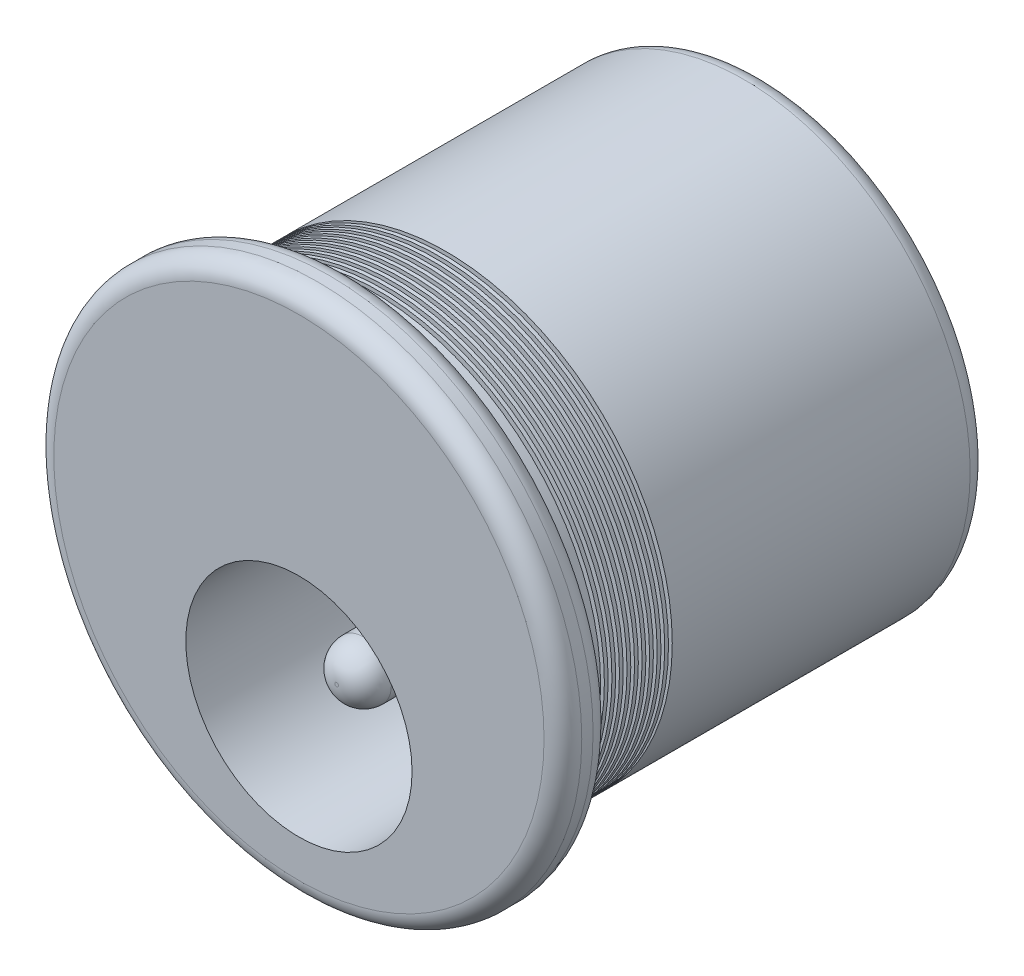
ISO-10303-21;
HEADER;
FILE_DESCRIPTION(('STEP AP214'),'2;1');
FILE_NAME('part.step','',(''),(''),'','','');
FILE_SCHEMA(('AUTOMOTIVE_DESIGN { 1 0 10303 214 1 1 1 1 }'));
ENDSEC;
DATA;
#1=APPLICATION_CONTEXT('core data for automotive mechanical design processes');
#2=APPLICATION_PROTOCOL_DEFINITION('international standard','automotive_design',2000,#1);
#3=PRODUCT_CONTEXT('',#1,'mechanical');
#4=PRODUCT('Part','Part','',(#3));
#5=PRODUCT_RELATED_PRODUCT_CATEGORY('part','',(#4));
#6=PRODUCT_DEFINITION_FORMATION('','',#4);
#7=PRODUCT_DEFINITION_CONTEXT('part definition',#1,'design');
#8=PRODUCT_DEFINITION('design','',#6,#7);
#9=PRODUCT_DEFINITION_SHAPE('','',#8);
#10=(LENGTH_UNIT() NAMED_UNIT(*) SI_UNIT(.MILLI.,.METRE.));
#11=(NAMED_UNIT(*) PLANE_ANGLE_UNIT() SI_UNIT($,.RADIAN.));
#12=(NAMED_UNIT(*) SI_UNIT($,.STERADIAN.) SOLID_ANGLE_UNIT());
#13=UNCERTAINTY_MEASURE_WITH_UNIT(LENGTH_MEASURE(1.E-05),#10,'distance_accuracy_value','');
#14=(GEOMETRIC_REPRESENTATION_CONTEXT(3) GLOBAL_UNCERTAINTY_ASSIGNED_CONTEXT((#13)) GLOBAL_UNIT_ASSIGNED_CONTEXT((#10,
#11,#12)) REPRESENTATION_CONTEXT('',''));
#15=CARTESIAN_POINT('',(0.,0.,0.));
#16=DIRECTION('',(0.,0.,1.));
#17=DIRECTION('',(1.,0.,0.));
#18=AXIS2_PLACEMENT_3D('',#15,#16,#17);
#19=CARTESIAN_POINT('',(0.,0.,1.3));
#20=DIRECTION('',(0.,0.,-1.));
#21=DIRECTION('',(-1.,0.,0.));
#22=AXIS2_PLACEMENT_3D('',#19,#20,#21);
#23=CYLINDRICAL_SURFACE('',#22,7.);
#24=CARTESIAN_POINT('',(0.,0.,0.5));
#25=DIRECTION('',(0.,0.,-1.));
#26=DIRECTION('',(-1.,0.,0.));
#27=AXIS2_PLACEMENT_3D('',#24,#25,#26);
#28=CIRCLE('',#27,7.);
#29=CARTESIAN_POINT('',(-7.,0.,0.5));
#30=VERTEX_POINT('',#29);
#31=EDGE_CURVE('E52',#30,#30,#28,.F.);
#32=ORIENTED_EDGE('',*,*,#31,.T.);
#33=EDGE_LOOP('',(#32));
#34=FACE_BOUND('',#33,.T.);
#35=CARTESIAN_POINT('',(0.,0.,0.8));
#36=DIRECTION('',(0.,0.,1.));
#37=DIRECTION('',(1.,0.,0.));
#38=AXIS2_PLACEMENT_3D('',#35,#36,#37);
#39=CIRCLE('',#38,7.);
#40=CARTESIAN_POINT('',(7.,0.,0.8));
#41=VERTEX_POINT('',#40);
#42=EDGE_CURVE('E57',#41,#41,#39,.F.);
#43=ORIENTED_EDGE('',*,*,#42,.T.);
#44=EDGE_LOOP('',(#43));
#45=FACE_BOUND('',#44,.T.);
#46=ADVANCED_FACE('F37',(#34,#45),#23,.T.);
#47=CARTESIAN_POINT('',(7.,0.,1.3));
#48=DIRECTION('',(0.,0.,1.));
#49=DIRECTION('',(1.,0.,0.));
#50=AXIS2_PLACEMENT_3D('',#47,#48,#49);
#51=PLANE('',#50);
#52=CARTESIAN_POINT('',(0.,0.,1.3));
#53=DIRECTION('',(0.,0.,1.));
#54=DIRECTION('',(1.,0.,0.));
#55=AXIS2_PLACEMENT_3D('',#52,#53,#54);
#56=CIRCLE('',#55,6.5);
#57=CARTESIAN_POINT('',(6.5,0.,1.3));
#58=VERTEX_POINT('',#57);
#59=EDGE_CURVE('E48',#58,#58,#56,.T.);
#60=ORIENTED_EDGE('',*,*,#59,.T.);
#61=EDGE_LOOP('',(#60));
#62=FACE_BOUND('',#61,.T.);
#63=CARTESIAN_POINT('',(0.,-2.5,1.3));
#64=DIRECTION('',(0.,0.,1.));
#65=DIRECTION('',(1.,0.,0.));
#66=AXIS2_PLACEMENT_3D('',#63,#64,#65);
#67=CIRCLE('',#66,2.99999999999999);
#68=CARTESIAN_POINT('',(2.99999999999999,-2.5,1.3));
#69=VERTEX_POINT('',#68);
#70=EDGE_CURVE('E195',#69,#69,#67,.T.);
#71=ORIENTED_EDGE('',*,*,#70,.F.);
#72=EDGE_LOOP('',(#71));
#73=FACE_BOUND('',#72,.T.);
#74=ADVANCED_FACE('F217',(#62,#73),#51,.T.);
#75=CARTESIAN_POINT('',(0.,0.,-11.));
#76=DIRECTION('',(0.,0.,-1.));
#77=DIRECTION('',(-1.,0.,0.));
#78=AXIS2_PLACEMENT_3D('',#75,#76,#77);
#79=PLANE('',#78);
#80=CARTESIAN_POINT('',(0.,0.,-11.));
#81=DIRECTION('',(0.,0.,-1.));
#82=DIRECTION('',(-1.,0.,0.));
#83=AXIS2_PLACEMENT_3D('',#80,#81,#82);
#84=CIRCLE('',#83,5.5);
#85=CARTESIAN_POINT('',(-5.5,0.,-11.));
#86=VERTEX_POINT('',#85);
#87=EDGE_CURVE('E66',#86,#86,#84,.T.);
#88=ORIENTED_EDGE('',*,*,#87,.T.);
#89=EDGE_LOOP('',(#88));
#90=FACE_BOUND('',#89,.T.);
#91=ADVANCED_FACE('F219',(#90),#79,.T.);
#92=CARTESIAN_POINT('',(0.,0.,1.3));
#93=DIRECTION('',(0.,0.,-1.));
#94=DIRECTION('',(-1.,0.,0.));
#95=AXIS2_PLACEMENT_3D('',#92,#93,#94);
#96=CYLINDRICAL_SURFACE('',#95,6.);
#97=CARTESIAN_POINT('',(0.,0.,-10.5));
#98=DIRECTION('',(0.,0.,-1.));
#99=DIRECTION('',(-1.,0.,0.));
#100=AXIS2_PLACEMENT_3D('',#97,#98,#99);
#101=CIRCLE('',#100,6.);
#102=CARTESIAN_POINT('',(-6.,0.,-10.5));
#103=VERTEX_POINT('',#102);
#104=EDGE_CURVE('E63',#103,#103,#101,.F.);
#105=ORIENTED_EDGE('',*,*,#104,.T.);
#106=EDGE_LOOP('',(#105));
#107=FACE_BOUND('',#106,.T.);
#108=CARTESIAN_POINT('',(0.,0.,-2.6));
#109=DIRECTION('',(0.,0.,-1.));
#110=DIRECTION('',(-1.,0.,0.));
#111=AXIS2_PLACEMENT_3D('',#108,#109,#110);
#112=CIRCLE('',#111,6.);
#113=CARTESIAN_POINT('',(-6.,0.,-2.6));
#114=VERTEX_POINT('',#113);
#115=EDGE_CURVE('E69',#114,#114,#112,.T.);
#116=ORIENTED_EDGE('',*,*,#115,.T.);
#117=EDGE_LOOP('',(#116));
#118=FACE_BOUND('',#117,.T.);
#119=ADVANCED_FACE('F226',(#107,#118),#96,.T.);
#120=CARTESIAN_POINT('',(6.,0.,-2.6));
#121=DIRECTION('',(0.,0.,1.));
#122=DIRECTION('',(1.,0.,0.));
#123=AXIS2_PLACEMENT_3D('',#120,#121,#122);
#124=PLANE('',#123);
#125=CARTESIAN_POINT('',(0.,0.,-2.6));
#126=DIRECTION('',(0.,0.,-1.));
#127=DIRECTION('',(-1.,0.,0.));
#128=AXIS2_PLACEMENT_3D('',#125,#126,#127);
#129=CIRCLE('',#128,5.75);
#130=CARTESIAN_POINT('',(-5.75,0.,-2.6));
#131=VERTEX_POINT('',#130);
#132=EDGE_CURVE('E72',#131,#131,#129,.T.);
#133=ORIENTED_EDGE('',*,*,#132,.T.);
#134=EDGE_LOOP('',(#133));
#135=FACE_BOUND('',#134,.T.);
#136=ORIENTED_EDGE('',*,*,#115,.F.);
#137=EDGE_LOOP('',(#136));
#138=FACE_BOUND('',#137,.T.);
#139=ADVANCED_FACE('F322',(#135,#138),#124,.T.);
#140=CARTESIAN_POINT('',(0.,0.,1.3));
#141=DIRECTION('',(0.,0.,-1.));
#142=DIRECTION('',(-1.,0.,0.));
#143=AXIS2_PLACEMENT_3D('',#140,#141,#142);
#144=CYLINDRICAL_SURFACE('',#143,5.75);
#145=CARTESIAN_POINT('',(0.,0.,-2.5));
#146=DIRECTION('',(0.,0.,-1.));
#147=DIRECTION('',(-1.,0.,0.));
#148=AXIS2_PLACEMENT_3D('',#145,#146,#147);
#149=CIRCLE('',#148,5.75);
#150=CARTESIAN_POINT('',(-5.75,0.,-2.5));
#151=VERTEX_POINT('',#150);
#152=EDGE_CURVE('E75',#151,#151,#149,.T.);
#153=ORIENTED_EDGE('',*,*,#152,.T.);
#154=EDGE_LOOP('',(#153));
#155=FACE_BOUND('',#154,.T.);
#156=ORIENTED_EDGE('',*,*,#132,.F.);
#157=EDGE_LOOP('',(#156));
#158=FACE_BOUND('',#157,.T.);
#159=ADVANCED_FACE('F772',(#155,#158),#144,.T.);
#160=CARTESIAN_POINT('',(5.75,0.,-2.5));
#161=DIRECTION('',(0.,0.,-1.));
#162=DIRECTION('',(-1.,0.,0.));
#163=AXIS2_PLACEMENT_3D('',#160,#161,#162);
#164=PLANE('',#163);
#165=CARTESIAN_POINT('',(0.,0.,-2.5));
#166=DIRECTION('',(0.,0.,-1.));
#167=DIRECTION('',(-1.,0.,0.));
#168=AXIS2_PLACEMENT_3D('',#165,#166,#167);
#169=CIRCLE('',#168,6.);
#170=CARTESIAN_POINT('',(-6.,0.,-2.5));
#171=VERTEX_POINT('',#170);
#172=EDGE_CURVE('E78',#171,#171,#169,.T.);
#173=ORIENTED_EDGE('',*,*,#172,.T.);
#174=EDGE_LOOP('',(#173));
#175=FACE_BOUND('',#174,.T.);
#176=ORIENTED_EDGE('',*,*,#152,.F.);
#177=EDGE_LOOP('',(#176));
#178=FACE_BOUND('',#177,.T.);
#179=ADVANCED_FACE('F761',(#175,#178),#164,.T.);
#180=CARTESIAN_POINT('',(0.,0.,1.3));
#181=DIRECTION('',(0.,0.,-1.));
#182=DIRECTION('',(-1.,0.,0.));
#183=AXIS2_PLACEMENT_3D('',#180,#181,#182);
#184=CYLINDRICAL_SURFACE('',#183,6.);
#185=CARTESIAN_POINT('',(0.,0.,-2.4));
#186=DIRECTION('',(0.,0.,-1.));
#187=DIRECTION('',(-1.,0.,0.));
#188=AXIS2_PLACEMENT_3D('',#185,#186,#187);
#189=CIRCLE('',#188,6.);
#190=CARTESIAN_POINT('',(-6.,0.,-2.4));
#191=VERTEX_POINT('',#190);
#192=EDGE_CURVE('E81',#191,#191,#189,.T.);
#193=ORIENTED_EDGE('',*,*,#192,.T.);
#194=EDGE_LOOP('',(#193));
#195=FACE_BOUND('',#194,.T.);
#196=ORIENTED_EDGE('',*,*,#172,.F.);
#197=EDGE_LOOP('',(#196));
#198=FACE_BOUND('',#197,.T.);
#199=ADVANCED_FACE('F750',(#195,#198),#184,.T.);
#200=CARTESIAN_POINT('',(6.,0.,-2.4));
#201=DIRECTION('',(0.,0.,1.));
#202=DIRECTION('',(1.,0.,0.));
#203=AXIS2_PLACEMENT_3D('',#200,#201,#202);
#204=PLANE('',#203);
#205=CARTESIAN_POINT('',(0.,0.,-2.4));
#206=DIRECTION('',(0.,0.,-1.));
#207=DIRECTION('',(-1.,0.,0.));
#208=AXIS2_PLACEMENT_3D('',#205,#206,#207);
#209=CIRCLE('',#208,5.75);
#210=CARTESIAN_POINT('',(-5.75,0.,-2.4));
#211=VERTEX_POINT('',#210);
#212=EDGE_CURVE('E84',#211,#211,#209,.T.);
#213=ORIENTED_EDGE('',*,*,#212,.T.);
#214=EDGE_LOOP('',(#213));
#215=FACE_BOUND('',#214,.T.);
#216=ORIENTED_EDGE('',*,*,#192,.F.);
#217=EDGE_LOOP('',(#216));
#218=FACE_BOUND('',#217,.T.);
#219=ADVANCED_FACE('F739',(#215,#218),#204,.T.);
#220=CARTESIAN_POINT('',(0.,0.,1.3));
#221=DIRECTION('',(0.,0.,-1.));
#222=DIRECTION('',(-1.,0.,0.));
#223=AXIS2_PLACEMENT_3D('',#220,#221,#222);
#224=CYLINDRICAL_SURFACE('',#223,5.75);
#225=CARTESIAN_POINT('',(0.,0.,-2.3));
#226=DIRECTION('',(0.,0.,-1.));
#227=DIRECTION('',(-1.,0.,0.));
#228=AXIS2_PLACEMENT_3D('',#225,#226,#227);
#229=CIRCLE('',#228,5.75);
#230=CARTESIAN_POINT('',(-5.75,0.,-2.3));
#231=VERTEX_POINT('',#230);
#232=EDGE_CURVE('E87',#231,#231,#229,.T.);
#233=ORIENTED_EDGE('',*,*,#232,.T.);
#234=EDGE_LOOP('',(#233));
#235=FACE_BOUND('',#234,.T.);
#236=ORIENTED_EDGE('',*,*,#212,.F.);
#237=EDGE_LOOP('',(#236));
#238=FACE_BOUND('',#237,.T.);
#239=ADVANCED_FACE('F728',(#235,#238),#224,.T.);
#240=CARTESIAN_POINT('',(5.75,0.,-2.3));
#241=DIRECTION('',(0.,0.,-1.));
#242=DIRECTION('',(-1.,0.,0.));
#243=AXIS2_PLACEMENT_3D('',#240,#241,#242);
#244=PLANE('',#243);
#245=CARTESIAN_POINT('',(0.,0.,-2.3));
#246=DIRECTION('',(0.,0.,-1.));
#247=DIRECTION('',(-1.,0.,0.));
#248=AXIS2_PLACEMENT_3D('',#245,#246,#247);
#249=CIRCLE('',#248,6.);
#250=CARTESIAN_POINT('',(-6.,0.,-2.3));
#251=VERTEX_POINT('',#250);
#252=EDGE_CURVE('E90',#251,#251,#249,.T.);
#253=ORIENTED_EDGE('',*,*,#252,.T.);
#254=EDGE_LOOP('',(#253));
#255=FACE_BOUND('',#254,.T.);
#256=ORIENTED_EDGE('',*,*,#232,.F.);
#257=EDGE_LOOP('',(#256));
#258=FACE_BOUND('',#257,.T.);
#259=ADVANCED_FACE('F717',(#255,#258),#244,.T.);
#260=CARTESIAN_POINT('',(0.,0.,1.3));
#261=DIRECTION('',(0.,0.,-1.));
#262=DIRECTION('',(-1.,0.,0.));
#263=AXIS2_PLACEMENT_3D('',#260,#261,#262);
#264=CYLINDRICAL_SURFACE('',#263,6.);
#265=CARTESIAN_POINT('',(0.,0.,-2.2));
#266=DIRECTION('',(0.,0.,-1.));
#267=DIRECTION('',(-1.,0.,0.));
#268=AXIS2_PLACEMENT_3D('',#265,#266,#267);
#269=CIRCLE('',#268,6.);
#270=CARTESIAN_POINT('',(-6.,0.,-2.2));
#271=VERTEX_POINT('',#270);
#272=EDGE_CURVE('E93',#271,#271,#269,.T.);
#273=ORIENTED_EDGE('',*,*,#272,.T.);
#274=EDGE_LOOP('',(#273));
#275=FACE_BOUND('',#274,.T.);
#276=ORIENTED_EDGE('',*,*,#252,.F.);
#277=EDGE_LOOP('',(#276));
#278=FACE_BOUND('',#277,.T.);
#279=ADVANCED_FACE('F706',(#275,#278),#264,.T.);
#280=CARTESIAN_POINT('',(6.,0.,-2.2));
#281=DIRECTION('',(0.,0.,1.));
#282=DIRECTION('',(1.,0.,0.));
#283=AXIS2_PLACEMENT_3D('',#280,#281,#282);
#284=PLANE('',#283);
#285=CARTESIAN_POINT('',(0.,0.,-2.2));
#286=DIRECTION('',(0.,0.,-1.));
#287=DIRECTION('',(-1.,0.,0.));
#288=AXIS2_PLACEMENT_3D('',#285,#286,#287);
#289=CIRCLE('',#288,5.75);
#290=CARTESIAN_POINT('',(-5.75,0.,-2.2));
#291=VERTEX_POINT('',#290);
#292=EDGE_CURVE('E96',#291,#291,#289,.T.);
#293=ORIENTED_EDGE('',*,*,#292,.T.);
#294=EDGE_LOOP('',(#293));
#295=FACE_BOUND('',#294,.T.);
#296=ORIENTED_EDGE('',*,*,#272,.F.);
#297=EDGE_LOOP('',(#296));
#298=FACE_BOUND('',#297,.T.);
#299=ADVANCED_FACE('F695',(#295,#298),#284,.T.);
#300=CARTESIAN_POINT('',(0.,0.,1.3));
#301=DIRECTION('',(0.,0.,-1.));
#302=DIRECTION('',(-1.,0.,0.));
#303=AXIS2_PLACEMENT_3D('',#300,#301,#302);
#304=CYLINDRICAL_SURFACE('',#303,5.75);
#305=CARTESIAN_POINT('',(0.,0.,-2.1));
#306=DIRECTION('',(0.,0.,-1.));
#307=DIRECTION('',(-1.,0.,0.));
#308=AXIS2_PLACEMENT_3D('',#305,#306,#307);
#309=CIRCLE('',#308,5.75);
#310=CARTESIAN_POINT('',(-5.75,0.,-2.1));
#311=VERTEX_POINT('',#310);
#312=EDGE_CURVE('E99',#311,#311,#309,.T.);
#313=ORIENTED_EDGE('',*,*,#312,.T.);
#314=EDGE_LOOP('',(#313));
#315=FACE_BOUND('',#314,.T.);
#316=ORIENTED_EDGE('',*,*,#292,.F.);
#317=EDGE_LOOP('',(#316));
#318=FACE_BOUND('',#317,.T.);
#319=ADVANCED_FACE('F684',(#315,#318),#304,.T.);
#320=CARTESIAN_POINT('',(5.75,0.,-2.1));
#321=DIRECTION('',(0.,0.,-1.));
#322=DIRECTION('',(-1.,0.,0.));
#323=AXIS2_PLACEMENT_3D('',#320,#321,#322);
#324=PLANE('',#323);
#325=CARTESIAN_POINT('',(0.,0.,-2.1));
#326=DIRECTION('',(0.,0.,-1.));
#327=DIRECTION('',(-1.,0.,0.));
#328=AXIS2_PLACEMENT_3D('',#325,#326,#327);
#329=CIRCLE('',#328,6.);
#330=CARTESIAN_POINT('',(-6.,0.,-2.1));
#331=VERTEX_POINT('',#330);
#332=EDGE_CURVE('E102',#331,#331,#329,.T.);
#333=ORIENTED_EDGE('',*,*,#332,.T.);
#334=EDGE_LOOP('',(#333));
#335=FACE_BOUND('',#334,.T.);
#336=ORIENTED_EDGE('',*,*,#312,.F.);
#337=EDGE_LOOP('',(#336));
#338=FACE_BOUND('',#337,.T.);
#339=ADVANCED_FACE('F673',(#335,#338),#324,.T.);
#340=CARTESIAN_POINT('',(0.,0.,1.3));
#341=DIRECTION('',(0.,0.,-1.));
#342=DIRECTION('',(-1.,0.,0.));
#343=AXIS2_PLACEMENT_3D('',#340,#341,#342);
#344=CYLINDRICAL_SURFACE('',#343,6.);
#345=CARTESIAN_POINT('',(0.,0.,-2.));
#346=DIRECTION('',(0.,0.,-1.));
#347=DIRECTION('',(-1.,0.,0.));
#348=AXIS2_PLACEMENT_3D('',#345,#346,#347);
#349=CIRCLE('',#348,6.);
#350=CARTESIAN_POINT('',(-6.,0.,-2.));
#351=VERTEX_POINT('',#350);
#352=EDGE_CURVE('E105',#351,#351,#349,.T.);
#353=ORIENTED_EDGE('',*,*,#352,.T.);
#354=EDGE_LOOP('',(#353));
#355=FACE_BOUND('',#354,.T.);
#356=ORIENTED_EDGE('',*,*,#332,.F.);
#357=EDGE_LOOP('',(#356));
#358=FACE_BOUND('',#357,.T.);
#359=ADVANCED_FACE('F662',(#355,#358),#344,.T.);
#360=CARTESIAN_POINT('',(6.,0.,-2.));
#361=DIRECTION('',(0.,0.,1.));
#362=DIRECTION('',(1.,0.,0.));
#363=AXIS2_PLACEMENT_3D('',#360,#361,#362);
#364=PLANE('',#363);
#365=CARTESIAN_POINT('',(0.,0.,-2.));
#366=DIRECTION('',(0.,0.,-1.));
#367=DIRECTION('',(-1.,0.,0.));
#368=AXIS2_PLACEMENT_3D('',#365,#366,#367);
#369=CIRCLE('',#368,5.75);
#370=CARTESIAN_POINT('',(-5.75,0.,-2.));
#371=VERTEX_POINT('',#370);
#372=EDGE_CURVE('E108',#371,#371,#369,.T.);
#373=ORIENTED_EDGE('',*,*,#372,.T.);
#374=EDGE_LOOP('',(#373));
#375=FACE_BOUND('',#374,.T.);
#376=ORIENTED_EDGE('',*,*,#352,.F.);
#377=EDGE_LOOP('',(#376));
#378=FACE_BOUND('',#377,.T.);
#379=ADVANCED_FACE('F651',(#375,#378),#364,.T.);
#380=CARTESIAN_POINT('',(0.,0.,1.3));
#381=DIRECTION('',(0.,0.,-1.));
#382=DIRECTION('',(-1.,0.,0.));
#383=AXIS2_PLACEMENT_3D('',#380,#381,#382);
#384=CYLINDRICAL_SURFACE('',#383,5.75);
#385=CARTESIAN_POINT('',(0.,0.,-1.9));
#386=DIRECTION('',(0.,0.,-1.));
#387=DIRECTION('',(-1.,0.,0.));
#388=AXIS2_PLACEMENT_3D('',#385,#386,#387);
#389=CIRCLE('',#388,5.75);
#390=CARTESIAN_POINT('',(-5.75,0.,-1.9));
#391=VERTEX_POINT('',#390);
#392=EDGE_CURVE('E111',#391,#391,#389,.T.);
#393=ORIENTED_EDGE('',*,*,#392,.T.);
#394=EDGE_LOOP('',(#393));
#395=FACE_BOUND('',#394,.T.);
#396=ORIENTED_EDGE('',*,*,#372,.F.);
#397=EDGE_LOOP('',(#396));
#398=FACE_BOUND('',#397,.T.);
#399=ADVANCED_FACE('F640',(#395,#398),#384,.T.);
#400=CARTESIAN_POINT('',(5.75,0.,-1.9));
#401=DIRECTION('',(0.,0.,-1.));
#402=DIRECTION('',(-1.,0.,0.));
#403=AXIS2_PLACEMENT_3D('',#400,#401,#402);
#404=PLANE('',#403);
#405=CARTESIAN_POINT('',(0.,0.,-1.9));
#406=DIRECTION('',(0.,0.,-1.));
#407=DIRECTION('',(-1.,0.,0.));
#408=AXIS2_PLACEMENT_3D('',#405,#406,#407);
#409=CIRCLE('',#408,6.);
#410=CARTESIAN_POINT('',(-6.,0.,-1.9));
#411=VERTEX_POINT('',#410);
#412=EDGE_CURVE('E114',#411,#411,#409,.T.);
#413=ORIENTED_EDGE('',*,*,#412,.T.);
#414=EDGE_LOOP('',(#413));
#415=FACE_BOUND('',#414,.T.);
#416=ORIENTED_EDGE('',*,*,#392,.F.);
#417=EDGE_LOOP('',(#416));
#418=FACE_BOUND('',#417,.T.);
#419=ADVANCED_FACE('F629',(#415,#418),#404,.T.);
#420=CARTESIAN_POINT('',(0.,0.,1.3));
#421=DIRECTION('',(0.,0.,-1.));
#422=DIRECTION('',(-1.,0.,0.));
#423=AXIS2_PLACEMENT_3D('',#420,#421,#422);
#424=CYLINDRICAL_SURFACE('',#423,6.);
#425=CARTESIAN_POINT('',(0.,0.,-1.8));
#426=DIRECTION('',(0.,0.,-1.));
#427=DIRECTION('',(-1.,0.,0.));
#428=AXIS2_PLACEMENT_3D('',#425,#426,#427);
#429=CIRCLE('',#428,6.);
#430=CARTESIAN_POINT('',(-6.,0.,-1.8));
#431=VERTEX_POINT('',#430);
#432=EDGE_CURVE('E117',#431,#431,#429,.T.);
#433=ORIENTED_EDGE('',*,*,#432,.T.);
#434=EDGE_LOOP('',(#433));
#435=FACE_BOUND('',#434,.T.);
#436=ORIENTED_EDGE('',*,*,#412,.F.);
#437=EDGE_LOOP('',(#436));
#438=FACE_BOUND('',#437,.T.);
#439=ADVANCED_FACE('F618',(#435,#438),#424,.T.);
#440=CARTESIAN_POINT('',(6.,0.,-1.8));
#441=DIRECTION('',(0.,0.,1.));
#442=DIRECTION('',(1.,0.,0.));
#443=AXIS2_PLACEMENT_3D('',#440,#441,#442);
#444=PLANE('',#443);
#445=CARTESIAN_POINT('',(0.,0.,-1.8));
#446=DIRECTION('',(0.,0.,-1.));
#447=DIRECTION('',(-1.,0.,0.));
#448=AXIS2_PLACEMENT_3D('',#445,#446,#447);
#449=CIRCLE('',#448,5.75);
#450=CARTESIAN_POINT('',(-5.75,0.,-1.8));
#451=VERTEX_POINT('',#450);
#452=EDGE_CURVE('E120',#451,#451,#449,.T.);
#453=ORIENTED_EDGE('',*,*,#452,.T.);
#454=EDGE_LOOP('',(#453));
#455=FACE_BOUND('',#454,.T.);
#456=ORIENTED_EDGE('',*,*,#432,.F.);
#457=EDGE_LOOP('',(#456));
#458=FACE_BOUND('',#457,.T.);
#459=ADVANCED_FACE('F607',(#455,#458),#444,.T.);
#460=CARTESIAN_POINT('',(0.,0.,1.3));
#461=DIRECTION('',(0.,0.,-1.));
#462=DIRECTION('',(-1.,0.,0.));
#463=AXIS2_PLACEMENT_3D('',#460,#461,#462);
#464=CYLINDRICAL_SURFACE('',#463,5.75);
#465=CARTESIAN_POINT('',(0.,0.,-1.7));
#466=DIRECTION('',(0.,0.,-1.));
#467=DIRECTION('',(-1.,0.,0.));
#468=AXIS2_PLACEMENT_3D('',#465,#466,#467);
#469=CIRCLE('',#468,5.75);
#470=CARTESIAN_POINT('',(-5.75,0.,-1.7));
#471=VERTEX_POINT('',#470);
#472=EDGE_CURVE('E123',#471,#471,#469,.T.);
#473=ORIENTED_EDGE('',*,*,#472,.T.);
#474=EDGE_LOOP('',(#473));
#475=FACE_BOUND('',#474,.T.);
#476=ORIENTED_EDGE('',*,*,#452,.F.);
#477=EDGE_LOOP('',(#476));
#478=FACE_BOUND('',#477,.T.);
#479=ADVANCED_FACE('F596',(#475,#478),#464,.T.);
#480=CARTESIAN_POINT('',(5.75,0.,-1.7));
#481=DIRECTION('',(0.,0.,-1.));
#482=DIRECTION('',(-1.,0.,0.));
#483=AXIS2_PLACEMENT_3D('',#480,#481,#482);
#484=PLANE('',#483);
#485=CARTESIAN_POINT('',(0.,0.,-1.7));
#486=DIRECTION('',(0.,0.,-1.));
#487=DIRECTION('',(-1.,0.,0.));
#488=AXIS2_PLACEMENT_3D('',#485,#486,#487);
#489=CIRCLE('',#488,6.);
#490=CARTESIAN_POINT('',(-6.,0.,-1.7));
#491=VERTEX_POINT('',#490);
#492=EDGE_CURVE('E126',#491,#491,#489,.T.);
#493=ORIENTED_EDGE('',*,*,#492,.T.);
#494=EDGE_LOOP('',(#493));
#495=FACE_BOUND('',#494,.T.);
#496=ORIENTED_EDGE('',*,*,#472,.F.);
#497=EDGE_LOOP('',(#496));
#498=FACE_BOUND('',#497,.T.);
#499=ADVANCED_FACE('F585',(#495,#498),#484,.T.);
#500=CARTESIAN_POINT('',(0.,0.,1.3));
#501=DIRECTION('',(0.,0.,-1.));
#502=DIRECTION('',(-1.,0.,0.));
#503=AXIS2_PLACEMENT_3D('',#500,#501,#502);
#504=CYLINDRICAL_SURFACE('',#503,6.);
#505=CARTESIAN_POINT('',(0.,0.,-1.6));
#506=DIRECTION('',(0.,0.,-1.));
#507=DIRECTION('',(-1.,0.,0.));
#508=AXIS2_PLACEMENT_3D('',#505,#506,#507);
#509=CIRCLE('',#508,6.);
#510=CARTESIAN_POINT('',(-6.,0.,-1.6));
#511=VERTEX_POINT('',#510);
#512=EDGE_CURVE('E129',#511,#511,#509,.T.);
#513=ORIENTED_EDGE('',*,*,#512,.T.);
#514=EDGE_LOOP('',(#513));
#515=FACE_BOUND('',#514,.T.);
#516=ORIENTED_EDGE('',*,*,#492,.F.);
#517=EDGE_LOOP('',(#516));
#518=FACE_BOUND('',#517,.T.);
#519=ADVANCED_FACE('F574',(#515,#518),#504,.T.);
#520=CARTESIAN_POINT('',(6.,0.,-1.6));
#521=DIRECTION('',(0.,0.,1.));
#522=DIRECTION('',(1.,0.,0.));
#523=AXIS2_PLACEMENT_3D('',#520,#521,#522);
#524=PLANE('',#523);
#525=CARTESIAN_POINT('',(0.,0.,-1.6));
#526=DIRECTION('',(0.,0.,-1.));
#527=DIRECTION('',(-1.,0.,0.));
#528=AXIS2_PLACEMENT_3D('',#525,#526,#527);
#529=CIRCLE('',#528,5.75);
#530=CARTESIAN_POINT('',(-5.75,0.,-1.6));
#531=VERTEX_POINT('',#530);
#532=EDGE_CURVE('E132',#531,#531,#529,.T.);
#533=ORIENTED_EDGE('',*,*,#532,.T.);
#534=EDGE_LOOP('',(#533));
#535=FACE_BOUND('',#534,.T.);
#536=ORIENTED_EDGE('',*,*,#512,.F.);
#537=EDGE_LOOP('',(#536));
#538=FACE_BOUND('',#537,.T.);
#539=ADVANCED_FACE('F563',(#535,#538),#524,.T.);
#540=CARTESIAN_POINT('',(0.,0.,1.3));
#541=DIRECTION('',(0.,0.,-1.));
#542=DIRECTION('',(-1.,0.,0.));
#543=AXIS2_PLACEMENT_3D('',#540,#541,#542);
#544=CYLINDRICAL_SURFACE('',#543,5.75);
#545=CARTESIAN_POINT('',(0.,0.,-1.5));
#546=DIRECTION('',(0.,0.,-1.));
#547=DIRECTION('',(-1.,0.,0.));
#548=AXIS2_PLACEMENT_3D('',#545,#546,#547);
#549=CIRCLE('',#548,5.75);
#550=CARTESIAN_POINT('',(-5.75,0.,-1.5));
#551=VERTEX_POINT('',#550);
#552=EDGE_CURVE('E135',#551,#551,#549,.T.);
#553=ORIENTED_EDGE('',*,*,#552,.T.);
#554=EDGE_LOOP('',(#553));
#555=FACE_BOUND('',#554,.T.);
#556=ORIENTED_EDGE('',*,*,#532,.F.);
#557=EDGE_LOOP('',(#556));
#558=FACE_BOUND('',#557,.T.);
#559=ADVANCED_FACE('F552',(#555,#558),#544,.T.);
#560=CARTESIAN_POINT('',(5.75,0.,-1.5));
#561=DIRECTION('',(0.,0.,-1.));
#562=DIRECTION('',(-1.,0.,0.));
#563=AXIS2_PLACEMENT_3D('',#560,#561,#562);
#564=PLANE('',#563);
#565=CARTESIAN_POINT('',(0.,0.,-1.5));
#566=DIRECTION('',(0.,0.,-1.));
#567=DIRECTION('',(-1.,0.,0.));
#568=AXIS2_PLACEMENT_3D('',#565,#566,#567);
#569=CIRCLE('',#568,6.);
#570=CARTESIAN_POINT('',(-6.,0.,-1.5));
#571=VERTEX_POINT('',#570);
#572=EDGE_CURVE('E138',#571,#571,#569,.T.);
#573=ORIENTED_EDGE('',*,*,#572,.T.);
#574=EDGE_LOOP('',(#573));
#575=FACE_BOUND('',#574,.T.);
#576=ORIENTED_EDGE('',*,*,#552,.F.);
#577=EDGE_LOOP('',(#576));
#578=FACE_BOUND('',#577,.T.);
#579=ADVANCED_FACE('F541',(#575,#578),#564,.T.);
#580=CARTESIAN_POINT('',(0.,0.,1.3));
#581=DIRECTION('',(0.,0.,-1.));
#582=DIRECTION('',(-1.,0.,0.));
#583=AXIS2_PLACEMENT_3D('',#580,#581,#582);
#584=CYLINDRICAL_SURFACE('',#583,6.);
#585=CARTESIAN_POINT('',(0.,0.,-1.4));
#586=DIRECTION('',(0.,0.,-1.));
#587=DIRECTION('',(-1.,0.,0.));
#588=AXIS2_PLACEMENT_3D('',#585,#586,#587);
#589=CIRCLE('',#588,6.);
#590=CARTESIAN_POINT('',(-6.,0.,-1.4));
#591=VERTEX_POINT('',#590);
#592=EDGE_CURVE('E141',#591,#591,#589,.T.);
#593=ORIENTED_EDGE('',*,*,#592,.T.);
#594=EDGE_LOOP('',(#593));
#595=FACE_BOUND('',#594,.T.);
#596=ORIENTED_EDGE('',*,*,#572,.F.);
#597=EDGE_LOOP('',(#596));
#598=FACE_BOUND('',#597,.T.);
#599=ADVANCED_FACE('F530',(#595,#598),#584,.T.);
#600=CARTESIAN_POINT('',(6.,0.,-1.4));
#601=DIRECTION('',(0.,0.,1.));
#602=DIRECTION('',(1.,0.,0.));
#603=AXIS2_PLACEMENT_3D('',#600,#601,#602);
#604=PLANE('',#603);
#605=CARTESIAN_POINT('',(0.,0.,-1.4));
#606=DIRECTION('',(0.,0.,-1.));
#607=DIRECTION('',(-1.,0.,0.));
#608=AXIS2_PLACEMENT_3D('',#605,#606,#607);
#609=CIRCLE('',#608,5.75);
#610=CARTESIAN_POINT('',(-5.75,0.,-1.4));
#611=VERTEX_POINT('',#610);
#612=EDGE_CURVE('E144',#611,#611,#609,.T.);
#613=ORIENTED_EDGE('',*,*,#612,.T.);
#614=EDGE_LOOP('',(#613));
#615=FACE_BOUND('',#614,.T.);
#616=ORIENTED_EDGE('',*,*,#592,.F.);
#617=EDGE_LOOP('',(#616));
#618=FACE_BOUND('',#617,.T.);
#619=ADVANCED_FACE('F519',(#615,#618),#604,.T.);
#620=CARTESIAN_POINT('',(0.,0.,1.3));
#621=DIRECTION('',(0.,0.,-1.));
#622=DIRECTION('',(-1.,0.,0.));
#623=AXIS2_PLACEMENT_3D('',#620,#621,#622);
#624=CYLINDRICAL_SURFACE('',#623,5.75);
#625=CARTESIAN_POINT('',(0.,0.,-1.3));
#626=DIRECTION('',(0.,0.,-1.));
#627=DIRECTION('',(-1.,0.,0.));
#628=AXIS2_PLACEMENT_3D('',#625,#626,#627);
#629=CIRCLE('',#628,5.75);
#630=CARTESIAN_POINT('',(-5.75,0.,-1.3));
#631=VERTEX_POINT('',#630);
#632=EDGE_CURVE('E147',#631,#631,#629,.T.);
#633=ORIENTED_EDGE('',*,*,#632,.T.);
#634=EDGE_LOOP('',(#633));
#635=FACE_BOUND('',#634,.T.);
#636=ORIENTED_EDGE('',*,*,#612,.F.);
#637=EDGE_LOOP('',(#636));
#638=FACE_BOUND('',#637,.T.);
#639=ADVANCED_FACE('F508',(#635,#638),#624,.T.);
#640=CARTESIAN_POINT('',(5.75,0.,-1.3));
#641=DIRECTION('',(0.,0.,-1.));
#642=DIRECTION('',(-1.,0.,0.));
#643=AXIS2_PLACEMENT_3D('',#640,#641,#642);
#644=PLANE('',#643);
#645=CARTESIAN_POINT('',(0.,0.,-1.3));
#646=DIRECTION('',(0.,0.,-1.));
#647=DIRECTION('',(-1.,0.,0.));
#648=AXIS2_PLACEMENT_3D('',#645,#646,#647);
#649=CIRCLE('',#648,6.);
#650=CARTESIAN_POINT('',(-6.,0.,-1.3));
#651=VERTEX_POINT('',#650);
#652=EDGE_CURVE('E150',#651,#651,#649,.T.);
#653=ORIENTED_EDGE('',*,*,#652,.T.);
#654=EDGE_LOOP('',(#653));
#655=FACE_BOUND('',#654,.T.);
#656=ORIENTED_EDGE('',*,*,#632,.F.);
#657=EDGE_LOOP('',(#656));
#658=FACE_BOUND('',#657,.T.);
#659=ADVANCED_FACE('F497',(#655,#658),#644,.T.);
#660=CARTESIAN_POINT('',(0.,0.,1.3));
#661=DIRECTION('',(0.,0.,-1.));
#662=DIRECTION('',(-1.,0.,0.));
#663=AXIS2_PLACEMENT_3D('',#660,#661,#662);
#664=CYLINDRICAL_SURFACE('',#663,6.);
#665=CARTESIAN_POINT('',(0.,0.,-1.2));
#666=DIRECTION('',(0.,0.,-1.));
#667=DIRECTION('',(-1.,0.,0.));
#668=AXIS2_PLACEMENT_3D('',#665,#666,#667);
#669=CIRCLE('',#668,6.);
#670=CARTESIAN_POINT('',(-6.,0.,-1.2));
#671=VERTEX_POINT('',#670);
#672=EDGE_CURVE('E153',#671,#671,#669,.T.);
#673=ORIENTED_EDGE('',*,*,#672,.T.);
#674=EDGE_LOOP('',(#673));
#675=FACE_BOUND('',#674,.T.);
#676=ORIENTED_EDGE('',*,*,#652,.F.);
#677=EDGE_LOOP('',(#676));
#678=FACE_BOUND('',#677,.T.);
#679=ADVANCED_FACE('F486',(#675,#678),#664,.T.);
#680=CARTESIAN_POINT('',(6.,0.,-1.2));
#681=DIRECTION('',(0.,0.,1.));
#682=DIRECTION('',(1.,0.,0.));
#683=AXIS2_PLACEMENT_3D('',#680,#681,#682);
#684=PLANE('',#683);
#685=CARTESIAN_POINT('',(0.,0.,-1.2));
#686=DIRECTION('',(0.,0.,-1.));
#687=DIRECTION('',(-1.,0.,0.));
#688=AXIS2_PLACEMENT_3D('',#685,#686,#687);
#689=CIRCLE('',#688,5.75);
#690=CARTESIAN_POINT('',(-5.75,0.,-1.2));
#691=VERTEX_POINT('',#690);
#692=EDGE_CURVE('E156',#691,#691,#689,.T.);
#693=ORIENTED_EDGE('',*,*,#692,.T.);
#694=EDGE_LOOP('',(#693));
#695=FACE_BOUND('',#694,.T.);
#696=ORIENTED_EDGE('',*,*,#672,.F.);
#697=EDGE_LOOP('',(#696));
#698=FACE_BOUND('',#697,.T.);
#699=ADVANCED_FACE('F475',(#695,#698),#684,.T.);
#700=CARTESIAN_POINT('',(0.,0.,1.3));
#701=DIRECTION('',(0.,0.,-1.));
#702=DIRECTION('',(-1.,0.,0.));
#703=AXIS2_PLACEMENT_3D('',#700,#701,#702);
#704=CYLINDRICAL_SURFACE('',#703,5.75);
#705=CARTESIAN_POINT('',(0.,0.,-1.1));
#706=DIRECTION('',(0.,0.,-1.));
#707=DIRECTION('',(-1.,0.,0.));
#708=AXIS2_PLACEMENT_3D('',#705,#706,#707);
#709=CIRCLE('',#708,5.75);
#710=CARTESIAN_POINT('',(-5.75,0.,-1.1));
#711=VERTEX_POINT('',#710);
#712=EDGE_CURVE('E159',#711,#711,#709,.T.);
#713=ORIENTED_EDGE('',*,*,#712,.T.);
#714=EDGE_LOOP('',(#713));
#715=FACE_BOUND('',#714,.T.);
#716=ORIENTED_EDGE('',*,*,#692,.F.);
#717=EDGE_LOOP('',(#716));
#718=FACE_BOUND('',#717,.T.);
#719=ADVANCED_FACE('F464',(#715,#718),#704,.T.);
#720=CARTESIAN_POINT('',(5.75,0.,-1.1));
#721=DIRECTION('',(0.,0.,-1.));
#722=DIRECTION('',(-1.,0.,0.));
#723=AXIS2_PLACEMENT_3D('',#720,#721,#722);
#724=PLANE('',#723);
#725=CARTESIAN_POINT('',(0.,0.,-1.1));
#726=DIRECTION('',(0.,0.,-1.));
#727=DIRECTION('',(-1.,0.,0.));
#728=AXIS2_PLACEMENT_3D('',#725,#726,#727);
#729=CIRCLE('',#728,6.);
#730=CARTESIAN_POINT('',(-6.,0.,-1.1));
#731=VERTEX_POINT('',#730);
#732=EDGE_CURVE('E162',#731,#731,#729,.T.);
#733=ORIENTED_EDGE('',*,*,#732,.T.);
#734=EDGE_LOOP('',(#733));
#735=FACE_BOUND('',#734,.T.);
#736=ORIENTED_EDGE('',*,*,#712,.F.);
#737=EDGE_LOOP('',(#736));
#738=FACE_BOUND('',#737,.T.);
#739=ADVANCED_FACE('F453',(#735,#738),#724,.T.);
#740=CARTESIAN_POINT('',(0.,0.,1.3));
#741=DIRECTION('',(0.,0.,-1.));
#742=DIRECTION('',(-1.,0.,0.));
#743=AXIS2_PLACEMENT_3D('',#740,#741,#742);
#744=CYLINDRICAL_SURFACE('',#743,6.);
#745=CARTESIAN_POINT('',(0.,0.,-1.));
#746=DIRECTION('',(0.,0.,-1.));
#747=DIRECTION('',(-1.,0.,0.));
#748=AXIS2_PLACEMENT_3D('',#745,#746,#747);
#749=CIRCLE('',#748,6.);
#750=CARTESIAN_POINT('',(-6.,0.,-1.));
#751=VERTEX_POINT('',#750);
#752=EDGE_CURVE('E165',#751,#751,#749,.T.);
#753=ORIENTED_EDGE('',*,*,#752,.T.);
#754=EDGE_LOOP('',(#753));
#755=FACE_BOUND('',#754,.T.);
#756=ORIENTED_EDGE('',*,*,#732,.F.);
#757=EDGE_LOOP('',(#756));
#758=FACE_BOUND('',#757,.T.);
#759=ADVANCED_FACE('F442',(#755,#758),#744,.T.);
#760=CARTESIAN_POINT('',(6.,0.,-1.));
#761=DIRECTION('',(0.,0.,1.));
#762=DIRECTION('',(1.,0.,0.));
#763=AXIS2_PLACEMENT_3D('',#760,#761,#762);
#764=PLANE('',#763);
#765=CARTESIAN_POINT('',(0.,0.,-1.));
#766=DIRECTION('',(0.,0.,-1.));
#767=DIRECTION('',(-1.,0.,0.));
#768=AXIS2_PLACEMENT_3D('',#765,#766,#767);
#769=CIRCLE('',#768,5.75);
#770=CARTESIAN_POINT('',(-5.75,0.,-1.));
#771=VERTEX_POINT('',#770);
#772=EDGE_CURVE('E168',#771,#771,#769,.T.);
#773=ORIENTED_EDGE('',*,*,#772,.T.);
#774=EDGE_LOOP('',(#773));
#775=FACE_BOUND('',#774,.T.);
#776=ORIENTED_EDGE('',*,*,#752,.F.);
#777=EDGE_LOOP('',(#776));
#778=FACE_BOUND('',#777,.T.);
#779=ADVANCED_FACE('F431',(#775,#778),#764,.T.);
#780=CARTESIAN_POINT('',(0.,0.,1.3));
#781=DIRECTION('',(0.,0.,-1.));
#782=DIRECTION('',(-1.,0.,0.));
#783=AXIS2_PLACEMENT_3D('',#780,#781,#782);
#784=CYLINDRICAL_SURFACE('',#783,5.75);
#785=CARTESIAN_POINT('',(0.,0.,-0.9));
#786=DIRECTION('',(0.,0.,-1.));
#787=DIRECTION('',(-1.,0.,0.));
#788=AXIS2_PLACEMENT_3D('',#785,#786,#787);
#789=CIRCLE('',#788,5.75);
#790=CARTESIAN_POINT('',(-5.75,0.,-0.9));
#791=VERTEX_POINT('',#790);
#792=EDGE_CURVE('E171',#791,#791,#789,.T.);
#793=ORIENTED_EDGE('',*,*,#792,.T.);
#794=EDGE_LOOP('',(#793));
#795=FACE_BOUND('',#794,.T.);
#796=ORIENTED_EDGE('',*,*,#772,.F.);
#797=EDGE_LOOP('',(#796));
#798=FACE_BOUND('',#797,.T.);
#799=ADVANCED_FACE('F420',(#795,#798),#784,.T.);
#800=CARTESIAN_POINT('',(5.75,0.,-0.9));
#801=DIRECTION('',(0.,0.,-1.));
#802=DIRECTION('',(-1.,0.,0.));
#803=AXIS2_PLACEMENT_3D('',#800,#801,#802);
#804=PLANE('',#803);
#805=CARTESIAN_POINT('',(0.,0.,-0.9));
#806=DIRECTION('',(0.,0.,-1.));
#807=DIRECTION('',(-1.,0.,0.));
#808=AXIS2_PLACEMENT_3D('',#805,#806,#807);
#809=CIRCLE('',#808,6.);
#810=CARTESIAN_POINT('',(-6.,0.,-0.9));
#811=VERTEX_POINT('',#810);
#812=EDGE_CURVE('E174',#811,#811,#809,.T.);
#813=ORIENTED_EDGE('',*,*,#812,.T.);
#814=EDGE_LOOP('',(#813));
#815=FACE_BOUND('',#814,.T.);
#816=ORIENTED_EDGE('',*,*,#792,.F.);
#817=EDGE_LOOP('',(#816));
#818=FACE_BOUND('',#817,.T.);
#819=ADVANCED_FACE('F409',(#815,#818),#804,.T.);
#820=CARTESIAN_POINT('',(0.,0.,1.3));
#821=DIRECTION('',(0.,0.,-1.));
#822=DIRECTION('',(-1.,0.,0.));
#823=AXIS2_PLACEMENT_3D('',#820,#821,#822);
#824=CYLINDRICAL_SURFACE('',#823,6.);
#825=CARTESIAN_POINT('',(0.,0.,-0.8));
#826=DIRECTION('',(0.,0.,-1.));
#827=DIRECTION('',(-1.,0.,0.));
#828=AXIS2_PLACEMENT_3D('',#825,#826,#827);
#829=CIRCLE('',#828,6.);
#830=CARTESIAN_POINT('',(-6.,0.,-0.8));
#831=VERTEX_POINT('',#830);
#832=EDGE_CURVE('E177',#831,#831,#829,.T.);
#833=ORIENTED_EDGE('',*,*,#832,.T.);
#834=EDGE_LOOP('',(#833));
#835=FACE_BOUND('',#834,.T.);
#836=ORIENTED_EDGE('',*,*,#812,.F.);
#837=EDGE_LOOP('',(#836));
#838=FACE_BOUND('',#837,.T.);
#839=ADVANCED_FACE('F398',(#835,#838),#824,.T.);
#840=CARTESIAN_POINT('',(6.,0.,-0.8));
#841=DIRECTION('',(0.,0.,1.));
#842=DIRECTION('',(1.,0.,0.));
#843=AXIS2_PLACEMENT_3D('',#840,#841,#842);
#844=PLANE('',#843);
#845=CARTESIAN_POINT('',(0.,0.,-0.8));
#846=DIRECTION('',(0.,0.,-1.));
#847=DIRECTION('',(-1.,0.,0.));
#848=AXIS2_PLACEMENT_3D('',#845,#846,#847);
#849=CIRCLE('',#848,5.75);
#850=CARTESIAN_POINT('',(-5.75,0.,-0.8));
#851=VERTEX_POINT('',#850);
#852=EDGE_CURVE('E180',#851,#851,#849,.T.);
#853=ORIENTED_EDGE('',*,*,#852,.T.);
#854=EDGE_LOOP('',(#853));
#855=FACE_BOUND('',#854,.T.);
#856=ORIENTED_EDGE('',*,*,#832,.F.);
#857=EDGE_LOOP('',(#856));
#858=FACE_BOUND('',#857,.T.);
#859=ADVANCED_FACE('F387',(#855,#858),#844,.T.);
#860=CARTESIAN_POINT('',(0.,0.,1.3));
#861=DIRECTION('',(0.,0.,-1.));
#862=DIRECTION('',(-1.,0.,0.));
#863=AXIS2_PLACEMENT_3D('',#860,#861,#862);
#864=CYLINDRICAL_SURFACE('',#863,5.75);
#865=CARTESIAN_POINT('',(0.,0.,-0.7));
#866=DIRECTION('',(0.,0.,-1.));
#867=DIRECTION('',(-1.,0.,0.));
#868=AXIS2_PLACEMENT_3D('',#865,#866,#867);
#869=CIRCLE('',#868,5.75);
#870=CARTESIAN_POINT('',(-5.75,0.,-0.7));
#871=VERTEX_POINT('',#870);
#872=EDGE_CURVE('E183',#871,#871,#869,.T.);
#873=ORIENTED_EDGE('',*,*,#872,.T.);
#874=EDGE_LOOP('',(#873));
#875=FACE_BOUND('',#874,.T.);
#876=ORIENTED_EDGE('',*,*,#852,.F.);
#877=EDGE_LOOP('',(#876));
#878=FACE_BOUND('',#877,.T.);
#879=ADVANCED_FACE('F376',(#875,#878),#864,.T.);
#880=CARTESIAN_POINT('',(5.75,0.,-0.7));
#881=DIRECTION('',(0.,0.,-1.));
#882=DIRECTION('',(-1.,0.,0.));
#883=AXIS2_PLACEMENT_3D('',#880,#881,#882);
#884=PLANE('',#883);
#885=CARTESIAN_POINT('',(0.,0.,-0.7));
#886=DIRECTION('',(0.,0.,-1.));
#887=DIRECTION('',(-1.,0.,0.));
#888=AXIS2_PLACEMENT_3D('',#885,#886,#887);
#889=CIRCLE('',#888,6.);
#890=CARTESIAN_POINT('',(-6.,0.,-0.7));
#891=VERTEX_POINT('',#890);
#892=EDGE_CURVE('E186',#891,#891,#889,.T.);
#893=ORIENTED_EDGE('',*,*,#892,.T.);
#894=EDGE_LOOP('',(#893));
#895=FACE_BOUND('',#894,.T.);
#896=ORIENTED_EDGE('',*,*,#872,.F.);
#897=EDGE_LOOP('',(#896));
#898=FACE_BOUND('',#897,.T.);
#899=ADVANCED_FACE('F365',(#895,#898),#884,.T.);
#900=CARTESIAN_POINT('',(0.,0.,1.3));
#901=DIRECTION('',(0.,0.,-1.));
#902=DIRECTION('',(-1.,0.,0.));
#903=AXIS2_PLACEMENT_3D('',#900,#901,#902);
#904=CYLINDRICAL_SURFACE('',#903,6.);
#905=CARTESIAN_POINT('',(0.,0.,0.));
#906=DIRECTION('',(0.,0.,-1.));
#907=DIRECTION('',(-1.,0.,0.));
#908=AXIS2_PLACEMENT_3D('',#905,#906,#907);
#909=CIRCLE('',#908,6.);
#910=CARTESIAN_POINT('',(-6.,0.,0.));
#911=VERTEX_POINT('',#910);
#912=EDGE_CURVE('E189',#911,#911,#909,.T.);
#913=ORIENTED_EDGE('',*,*,#912,.T.);
#914=EDGE_LOOP('',(#913));
#915=FACE_BOUND('',#914,.T.);
#916=ORIENTED_EDGE('',*,*,#892,.F.);
#917=EDGE_LOOP('',(#916));
#918=FACE_BOUND('',#917,.T.);
#919=ADVANCED_FACE('F308',(#915,#918),#904,.T.);
#920=CARTESIAN_POINT('',(6.,0.,0.));
#921=DIRECTION('',(0.,0.,-1.));
#922=DIRECTION('',(-1.,0.,0.));
#923=AXIS2_PLACEMENT_3D('',#920,#921,#922);
#924=PLANE('',#923);
#925=CARTESIAN_POINT('',(0.,0.,0.));
#926=DIRECTION('',(0.,0.,-1.));
#927=DIRECTION('',(-1.,0.,0.));
#928=AXIS2_PLACEMENT_3D('',#925,#926,#927);
#929=CIRCLE('',#928,6.5);
#930=CARTESIAN_POINT('',(-6.5,0.,0.));
#931=VERTEX_POINT('',#930);
#932=EDGE_CURVE('E60',#931,#931,#929,.T.);
#933=ORIENTED_EDGE('',*,*,#932,.T.);
#934=EDGE_LOOP('',(#933));
#935=FACE_BOUND('',#934,.T.);
#936=ORIENTED_EDGE('',*,*,#912,.F.);
#937=EDGE_LOOP('',(#936));
#938=FACE_BOUND('',#937,.T.);
#939=ADVANCED_FACE('F208',(#935,#938),#924,.T.);
#940=CARTESIAN_POINT('',(0.,-2.5,-4.7));
#941=DIRECTION('',(0.,0.,-1.));
#942=DIRECTION('',(-1.,0.,0.));
#943=AXIS2_PLACEMENT_3D('',#940,#941,#942);
#944=PLANE('',#943);
#945=CARTESIAN_POINT('',(0.,-2.5,-4.7));
#946=DIRECTION('',(0.,0.,1.));
#947=DIRECTION('',(1.,0.,0.));
#948=AXIS2_PLACEMENT_3D('',#945,#946,#947);
#949=CIRCLE('',#948,0.75);
#950=CARTESIAN_POINT('',(0.75,-2.5,-4.7));
#951=VERTEX_POINT('',#950);
#952=EDGE_CURVE('E198',#951,#951,#949,.T.);
#953=ORIENTED_EDGE('',*,*,#952,.F.);
#954=EDGE_LOOP('',(#953));
#955=FACE_BOUND('',#954,.T.);
#956=CARTESIAN_POINT('',(0.,-2.5,-4.70000000000001));
#957=DIRECTION('',(0.,0.,1.));
#958=DIRECTION('',(1.,0.,0.));
#959=AXIS2_PLACEMENT_3D('',#956,#957,#958);
#960=CIRCLE('',#959,2.99999999999999);
#961=CARTESIAN_POINT('',(2.99999999999999,-2.5,-4.70000000000001));
#962=VERTEX_POINT('',#961);
#963=EDGE_CURVE('E192',#962,#962,#960,.T.);
#964=ORIENTED_EDGE('',*,*,#963,.T.);
#965=EDGE_LOOP('',(#964));
#966=FACE_BOUND('',#965,.T.);
#967=ADVANCED_FACE('F204',(#955,#966),#944,.F.);
#968=CARTESIAN_POINT('',(0.,-2.5,1.3));
#969=DIRECTION('',(0.,0.,1.));
#970=DIRECTION('',(1.,0.,0.));
#971=AXIS2_PLACEMENT_3D('',#968,#969,#970);
#972=CYLINDRICAL_SURFACE('',#971,2.99999999999999);
#973=ORIENTED_EDGE('',*,*,#963,.F.);
#974=EDGE_LOOP('',(#973));
#975=FACE_BOUND('',#974,.T.);
#976=ORIENTED_EDGE('',*,*,#70,.T.);
#977=EDGE_LOOP('',(#976));
#978=FACE_BOUND('',#977,.T.);
#979=ADVANCED_FACE('F207',(#975,#978),#972,.F.);
#980=CARTESIAN_POINT('',(0.,-2.5,-4.7));
#981=DIRECTION('',(0.,0.,1.));
#982=DIRECTION('',(1.,0.,0.));
#983=AXIS2_PLACEMENT_3D('',#980,#981,#982);
#984=CYLINDRICAL_SURFACE('',#983,0.75);
#985=CARTESIAN_POINT('',(0.,-2.5,-0.39999999999969));
#986=DIRECTION('',(0.,0.,1.));
#987=DIRECTION('',(1.,0.,0.));
#988=AXIS2_PLACEMENT_3D('',#985,#986,#987);
#989=CIRCLE('',#988,0.75);
#990=CARTESIAN_POINT('',(0.75,-2.5,-0.39999999999969));
#991=VERTEX_POINT('',#990);
#992=EDGE_CURVE('E10',#991,#991,#989,.F.);
#993=ORIENTED_EDGE('',*,*,#992,.T.);
#994=EDGE_LOOP('',(#993));
#995=FACE_BOUND('',#994,.T.);
#996=ORIENTED_EDGE('',*,*,#952,.T.);
#997=EDGE_LOOP('',(#996));
#998=FACE_BOUND('',#997,.T.);
#999=ADVANCED_FACE('F202',(#995,#998),#984,.T.);
#1000=CARTESIAN_POINT('',(0.,-2.5,0.3));
#1001=DIRECTION('',(0.,0.,1.));
#1002=DIRECTION('',(1.,0.,0.));
#1003=AXIS2_PLACEMENT_3D('',#1000,#1001,#1002);
#1004=PLANE('',#1003);
#1005=CARTESIAN_POINT('',(0.,-2.5,0.3));
#1006=DIRECTION('',(0.,0.,1.));
#1007=DIRECTION('',(1.,0.,0.));
#1008=AXIS2_PLACEMENT_3D('',#1005,#1006,#1007);
#1009=CIRCLE('',#1008,0.0500000000003106);
#1010=CARTESIAN_POINT('',(0.0500000000003106,-2.5,0.3));
#1011=VERTEX_POINT('',#1010);
#1012=EDGE_CURVE('E44',#1011,#1011,#1009,.T.);
#1013=ORIENTED_EDGE('',*,*,#1012,.T.);
#1014=EDGE_LOOP('',(#1013));
#1015=FACE_BOUND('',#1014,.T.);
#1016=ADVANCED_FACE('F237',(#1015),#1004,.T.);
#1017=CARTESIAN_POINT('',(0.,0.,-10.5));
#1018=DIRECTION('',(0.,0.,-1.));
#1019=DIRECTION('',(-1.,0.,0.));
#1020=AXIS2_PLACEMENT_3D('',#1017,#1018,#1019);
#1021=TOROIDAL_SURFACE('',#1020,5.5,0.5);
#1022=ORIENTED_EDGE('',*,*,#104,.F.);
#1023=EDGE_LOOP('',(#1022));
#1024=FACE_BOUND('',#1023,.T.);
#1025=ORIENTED_EDGE('',*,*,#87,.F.);
#1026=EDGE_LOOP('',(#1025));
#1027=FACE_BOUND('',#1026,.T.);
#1028=ADVANCED_FACE('F233',(#1024,#1027),#1021,.T.);
#1029=CARTESIAN_POINT('',(0.,0.,0.5));
#1030=DIRECTION('',(0.,0.,-1.));
#1031=DIRECTION('',(-1.,0.,0.));
#1032=AXIS2_PLACEMENT_3D('',#1029,#1030,#1031);
#1033=TOROIDAL_SURFACE('',#1032,6.5,0.5);
#1034=ORIENTED_EDGE('',*,*,#31,.F.);
#1035=EDGE_LOOP('',(#1034));
#1036=FACE_BOUND('',#1035,.T.);
#1037=ORIENTED_EDGE('',*,*,#932,.F.);
#1038=EDGE_LOOP('',(#1037));
#1039=FACE_BOUND('',#1038,.T.);
#1040=ADVANCED_FACE('F236',(#1036,#1039),#1033,.T.);
#1041=CARTESIAN_POINT('',(0.,0.,0.8));
#1042=DIRECTION('',(0.,0.,1.));
#1043=DIRECTION('',(1.,0.,0.));
#1044=AXIS2_PLACEMENT_3D('',#1041,#1042,#1043);
#1045=TOROIDAL_SURFACE('',#1044,6.5,0.5);
#1046=ORIENTED_EDGE('',*,*,#59,.F.);
#1047=EDGE_LOOP('',(#1046));
#1048=FACE_BOUND('',#1047,.T.);
#1049=ORIENTED_EDGE('',*,*,#42,.F.);
#1050=EDGE_LOOP('',(#1049));
#1051=FACE_BOUND('',#1050,.T.);
#1052=ADVANCED_FACE('F240',(#1048,#1051),#1045,.T.);
#1053=CARTESIAN_POINT('',(0.,-2.5,-0.39999999999969));
#1054=DIRECTION('',(0.,0.,1.));
#1055=DIRECTION('',(1.,0.,0.));
#1056=AXIS2_PLACEMENT_3D('',#1053,#1054,#1055);
#1057=DEGENERATE_TOROIDAL_SURFACE('',#1056,0.0500000000003106,0.699999999999689,.T.);
#1058=ORIENTED_EDGE('',*,*,#992,.F.);
#1059=EDGE_LOOP('',(#1058));
#1060=FACE_BOUND('',#1059,.T.);
#1061=ORIENTED_EDGE('',*,*,#1012,.F.);
#1062=EDGE_LOOP('',(#1061));
#1063=FACE_BOUND('',#1062,.T.);
#1064=ADVANCED_FACE('F39',(#1060,#1063),#1057,.T.);
#1065=CLOSED_SHELL('',(#46,#74,#91,#119,#139,#159,#179,#199,#219,#239,#259,#279,#299,#319,#339,
#359,#379,#399,#419,#439,#459,#479,#499,#519,#539,#559,#579,#599,#619,#639,#659,#679,#699,#719,
#739,#759,#779,#799,#819,#839,#859,#879,#899,#919,#939,#967,#979,#999,#1016,#1028,#1040,#1052,#1064));
#1066=MANIFOLD_SOLID_BREP('B2',#1065);
#1067=ADVANCED_BREP_SHAPE_REPRESENTATION('',(#18,#1066),#14);
#1068=SHAPE_DEFINITION_REPRESENTATION(#9,#1067);
ENDSEC;
END-ISO-10303-21;
